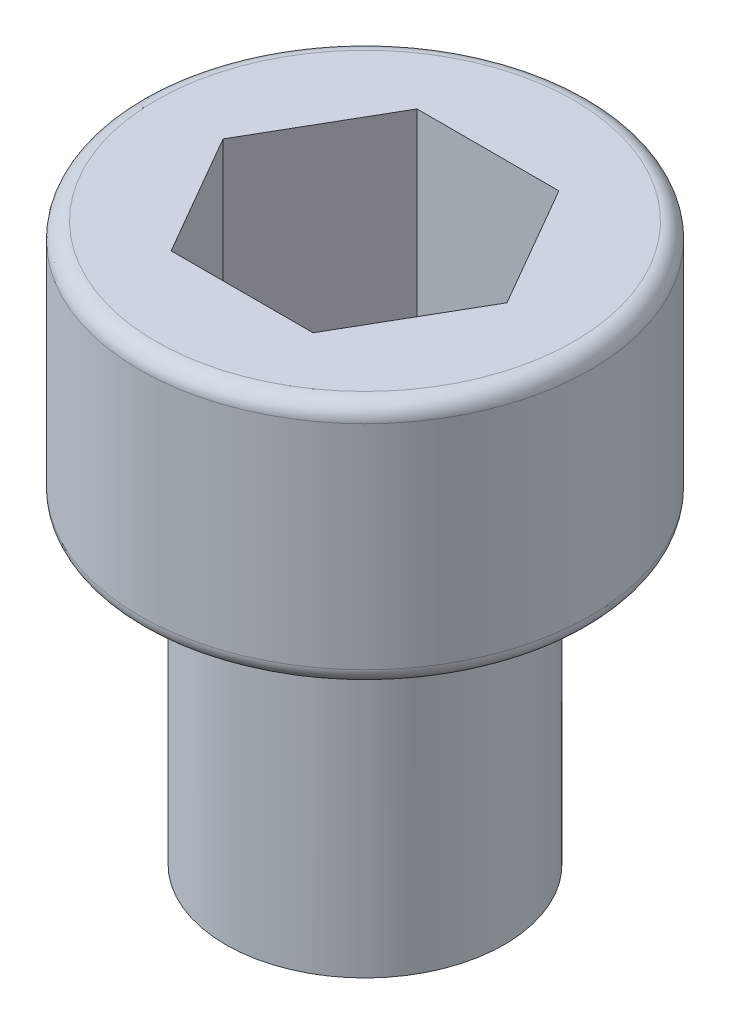
ISO-10303-21;
HEADER;
FILE_DESCRIPTION(('STEP AP214'),'2;1');
FILE_NAME('part.step','',(''),(''),'','','');
FILE_SCHEMA(('AUTOMOTIVE_DESIGN { 1 0 10303 214 1 1 1 1 }'));
ENDSEC;
DATA;
#1=APPLICATION_CONTEXT('core data for automotive mechanical design processes');
#2=APPLICATION_PROTOCOL_DEFINITION('international standard','automotive_design',2000,#1);
#3=PRODUCT_CONTEXT('',#1,'mechanical');
#4=PRODUCT('Part','Part','',(#3));
#5=PRODUCT_RELATED_PRODUCT_CATEGORY('part','',(#4));
#6=PRODUCT_DEFINITION_FORMATION('','',#4);
#7=PRODUCT_DEFINITION_CONTEXT('part definition',#1,'design');
#8=PRODUCT_DEFINITION('design','',#6,#7);
#9=PRODUCT_DEFINITION_SHAPE('','',#8);
#10=(LENGTH_UNIT() NAMED_UNIT(*) SI_UNIT(.MILLI.,.METRE.));
#11=(NAMED_UNIT(*) PLANE_ANGLE_UNIT() SI_UNIT($,.RADIAN.));
#12=(NAMED_UNIT(*) SI_UNIT($,.STERADIAN.) SOLID_ANGLE_UNIT());
#13=UNCERTAINTY_MEASURE_WITH_UNIT(LENGTH_MEASURE(1.E-05),#10,'distance_accuracy_value','');
#14=(GEOMETRIC_REPRESENTATION_CONTEXT(3) GLOBAL_UNCERTAINTY_ASSIGNED_CONTEXT((#13)) GLOBAL_UNIT_ASSIGNED_CONTEXT((#10,
#11,#12)) REPRESENTATION_CONTEXT('',''));
#15=CARTESIAN_POINT('',(0.,0.,0.));
#16=DIRECTION('',(0.,0.,1.));
#17=DIRECTION('',(1.,0.,0.));
#18=AXIS2_PLACEMENT_3D('',#15,#16,#17);
#19=CARTESIAN_POINT('',(0.,0.,0.));
#20=DIRECTION('',(0.,1.,0.));
#21=DIRECTION('',(0.,0.,1.));
#22=AXIS2_PLACEMENT_3D('',#19,#20,#21);
#23=PLANE('',#22);
#24=CARTESIAN_POINT('',(0.,0.,0.));
#25=DIRECTION('',(0.,1.,0.));
#26=DIRECTION('',(0.,0.,1.));
#27=AXIS2_PLACEMENT_3D('',#24,#25,#26);
#28=CIRCLE('',#27,2.159);
#29=CARTESIAN_POINT('',(0.,0.,2.159));
#30=VERTEX_POINT('',#29);
#31=EDGE_CURVE('E199',#30,#30,#28,.T.);
#32=ORIENTED_EDGE('',*,*,#31,.F.);
#33=EDGE_LOOP('',(#32));
#34=FACE_BOUND('',#33,.T.);
#35=ADVANCED_FACE('F32',(#34),#23,.F.);
#36=CARTESIAN_POINT('',(0.,0.,0.));
#37=DIRECTION('',(0.,1.,0.));
#38=DIRECTION('',(0.,0.,1.));
#39=AXIS2_PLACEMENT_3D('',#36,#37,#38);
#40=CYLINDRICAL_SURFACE('',#39,2.159);
#41=CARTESIAN_POINT('',(0.,4.826,0.));
#42=DIRECTION('',(0.,1.,0.));
#43=DIRECTION('',(0.,0.,1.));
#44=AXIS2_PLACEMENT_3D('',#41,#42,#43);
#45=CIRCLE('',#44,2.159);
#46=CARTESIAN_POINT('',(1.016,4.826,1.905));
#47=VERTEX_POINT('',#46);
#48=CARTESIAN_POINT('',(1.14177839420936,4.826,1.83238181024499));
#49=VERTEX_POINT('',#48);
#50=EDGE_CURVE('E197',#47,#49,#45,.T.);
#51=ORIENTED_EDGE('',*,*,#50,.F.);
#52=CARTESIAN_POINT('',(-1.01599999999999,4.826,1.905));
#53=VERTEX_POINT('',#52);
#54=EDGE_CURVE('E189',#53,#47,#45,.T.);
#55=ORIENTED_EDGE('',*,*,#54,.F.);
#56=CARTESIAN_POINT('',(-1.14177839420935,4.826,1.83238181024499));
#57=VERTEX_POINT('',#56);
#58=EDGE_CURVE('E370',#57,#53,#45,.T.);
#59=ORIENTED_EDGE('',*,*,#58,.F.);
#60=CARTESIAN_POINT('',(-2.15777839420935,4.826,0.072618189755009));
#61=VERTEX_POINT('',#60);
#62=EDGE_CURVE('E361',#61,#57,#45,.T.);
#63=ORIENTED_EDGE('',*,*,#62,.F.);
#64=CARTESIAN_POINT('',(-2.15777839420935,4.826,-0.072618189755012));
#65=VERTEX_POINT('',#64);
#66=EDGE_CURVE('E368',#65,#61,#45,.T.);
#67=ORIENTED_EDGE('',*,*,#66,.F.);
#68=CARTESIAN_POINT('',(-1.14177839420935,4.826,-1.83238181024499));
#69=VERTEX_POINT('',#68);
#70=EDGE_CURVE('E371',#69,#65,#45,.T.);
#71=ORIENTED_EDGE('',*,*,#70,.F.);
#72=CARTESIAN_POINT('',(-1.016,4.826,-1.905));
#73=VERTEX_POINT('',#72);
#74=EDGE_CURVE('E384',#73,#69,#45,.T.);
#75=ORIENTED_EDGE('',*,*,#74,.F.);
#76=CARTESIAN_POINT('',(1.01600000000001,4.826,-1.905));
#77=VERTEX_POINT('',#76);
#78=EDGE_CURVE('E382',#77,#73,#45,.T.);
#79=ORIENTED_EDGE('',*,*,#78,.F.);
#80=CARTESIAN_POINT('',(1.14177839420936,4.826,-1.83238181024499));
#81=VERTEX_POINT('',#80);
#82=EDGE_CURVE('E381',#81,#77,#45,.T.);
#83=ORIENTED_EDGE('',*,*,#82,.F.);
#84=CARTESIAN_POINT('',(2.15777839420936,4.826,-0.0726181897550125));
#85=VERTEX_POINT('',#84);
#86=EDGE_CURVE('E150',#85,#81,#45,.T.);
#87=ORIENTED_EDGE('',*,*,#86,.F.);
#88=CARTESIAN_POINT('',(2.15777839420936,4.826,0.0726181897550073));
#89=VERTEX_POINT('',#88);
#90=EDGE_CURVE('E380',#89,#85,#45,.T.);
#91=ORIENTED_EDGE('',*,*,#90,.F.);
#92=EDGE_CURVE('E200',#49,#89,#45,.T.);
#93=ORIENTED_EDGE('',*,*,#92,.F.);
#94=EDGE_LOOP('',(#51,#55,#59,#63,#67,#71,#75,#79,#83,#87,#91,#93));
#95=FACE_BOUND('',#94,.T.);
#96=ORIENTED_EDGE('',*,*,#31,.T.);
#97=EDGE_LOOP('',(#96));
#98=FACE_BOUND('',#97,.T.);
#99=ADVANCED_FACE('F229',(#95,#98),#40,.T.);
#100=CARTESIAN_POINT('',(2.159,4.826,0.));
#101=DIRECTION('',(0.,1.,0.));
#102=DIRECTION('',(0.,0.,1.));
#103=AXIS2_PLACEMENT_3D('',#100,#101,#102);
#104=PLANE('',#103);
#105=CARTESIAN_POINT('',(0.,4.826,0.));
#106=DIRECTION('',(0.,1.,0.));
#107=DIRECTION('',(0.,0.,1.));
#108=AXIS2_PLACEMENT_3D('',#105,#106,#107);
#109=CIRCLE('',#108,3.2385);
#110=CARTESIAN_POINT('',(0.,4.826,3.2385));
#111=VERTEX_POINT('',#110);
#112=EDGE_CURVE('E11',#111,#111,#109,.F.);
#113=ORIENTED_EDGE('',*,*,#112,.T.);
#114=EDGE_LOOP('',(#113));
#115=FACE_BOUND('',#114,.T.);
#116=DIRECTION('',(0.5,0.,-0.866025403784439));
#117=VECTOR('',#116,1.);
#118=CARTESIAN_POINT('',(1.09985226280624,4.826,1.905));
#119=LINE('',#118,#117);
#120=CARTESIAN_POINT('',(2.19970452561249,4.826,0.));
#121=VERTEX_POINT('',#120);
#122=EDGE_CURVE('E172',#89,#121,#119,.T.);
#123=ORIENTED_EDGE('',*,*,#122,.T.);
#124=DIRECTION('',(-0.5,0.,-0.866025403784439));
#125=VECTOR('',#124,1.);
#126=CARTESIAN_POINT('',(2.19970452561249,4.826,0.));
#127=LINE('',#126,#125);
#128=EDGE_CURVE('E47',#121,#85,#127,.T.);
#129=ORIENTED_EDGE('',*,*,#128,.T.);
#130=ORIENTED_EDGE('',*,*,#86,.T.);
#131=CARTESIAN_POINT('',(1.09985226280624,4.826,-1.905));
#132=VERTEX_POINT('',#131);
#133=EDGE_CURVE('E125',#81,#132,#127,.T.);
#134=ORIENTED_EDGE('',*,*,#133,.T.);
#135=DIRECTION('',(-1.,0.,0.));
#136=VECTOR('',#135,1.);
#137=CARTESIAN_POINT('',(1.09985226280624,4.826,-1.905));
#138=LINE('',#137,#136);
#139=EDGE_CURVE('E135',#132,#77,#138,.T.);
#140=ORIENTED_EDGE('',*,*,#139,.T.);
#141=ORIENTED_EDGE('',*,*,#78,.T.);
#142=CARTESIAN_POINT('',(-1.09985226280624,4.826,-1.905));
#143=VERTEX_POINT('',#142);
#144=EDGE_CURVE('E145',#73,#143,#138,.T.);
#145=ORIENTED_EDGE('',*,*,#144,.T.);
#146=DIRECTION('',(-0.5,0.,0.866025403784439));
#147=VECTOR('',#146,1.);
#148=CARTESIAN_POINT('',(-1.09985226280624,4.826,-1.905));
#149=LINE('',#148,#147);
#150=EDGE_CURVE('E160',#143,#69,#149,.T.);
#151=ORIENTED_EDGE('',*,*,#150,.T.);
#152=ORIENTED_EDGE('',*,*,#70,.T.);
#153=CARTESIAN_POINT('',(-2.19970452561247,4.826,0.));
#154=VERTEX_POINT('',#153);
#155=EDGE_CURVE('E143',#65,#154,#149,.T.);
#156=ORIENTED_EDGE('',*,*,#155,.T.);
#157=DIRECTION('',(0.5,0.,0.866025403784439));
#158=VECTOR('',#157,1.);
#159=CARTESIAN_POINT('',(-2.19970452561247,4.826,0.));
#160=LINE('',#159,#158);
#161=EDGE_CURVE('E164',#154,#61,#160,.T.);
#162=ORIENTED_EDGE('',*,*,#161,.T.);
#163=ORIENTED_EDGE('',*,*,#62,.T.);
#164=CARTESIAN_POINT('',(-1.09985226280624,4.826,1.905));
#165=VERTEX_POINT('',#164);
#166=EDGE_CURVE('E162',#57,#165,#160,.T.);
#167=ORIENTED_EDGE('',*,*,#166,.T.);
#168=DIRECTION('',(1.,0.,0.));
#169=VECTOR('',#168,1.);
#170=CARTESIAN_POINT('',(-1.09985226280624,4.826,1.905));
#171=LINE('',#170,#169);
#172=EDGE_CURVE('E169',#165,#53,#171,.T.);
#173=ORIENTED_EDGE('',*,*,#172,.T.);
#174=ORIENTED_EDGE('',*,*,#54,.T.);
#175=CARTESIAN_POINT('',(1.09985226280624,4.826,1.905));
#176=VERTEX_POINT('',#175);
#177=EDGE_CURVE('E167',#47,#176,#171,.T.);
#178=ORIENTED_EDGE('',*,*,#177,.T.);
#179=EDGE_CURVE('E55',#176,#49,#119,.T.);
#180=ORIENTED_EDGE('',*,*,#179,.T.);
#181=ORIENTED_EDGE('',*,*,#92,.T.);
#182=EDGE_LOOP('',(#123,#129,#130,#134,#140,#141,#145,#151,#152,#156,#162,#163,#167,#173,#174,
#178,#180,#181));
#183=FACE_BOUND('',#182,.T.);
#184=ADVANCED_FACE('F148',(#115,#183),#104,.F.);
#185=CARTESIAN_POINT('',(0.,0.,0.));
#186=DIRECTION('',(0.,1.,0.));
#187=DIRECTION('',(0.,0.,1.));
#188=AXIS2_PLACEMENT_3D('',#185,#186,#187);
#189=CYLINDRICAL_SURFACE('',#188,3.4925);
#190=CARTESIAN_POINT('',(0.,8.382,0.));
#191=DIRECTION('',(0.,-1.,0.));
#192=DIRECTION('',(0.,0.,-1.));
#193=AXIS2_PLACEMENT_3D('',#190,#191,#192);
#194=CIRCLE('',#193,3.4925);
#195=CARTESIAN_POINT('',(0.,8.382,-3.4925));
#196=VERTEX_POINT('',#195);
#197=EDGE_CURVE('E40',#196,#196,#194,.T.);
#198=ORIENTED_EDGE('',*,*,#197,.T.);
#199=EDGE_LOOP('',(#198));
#200=FACE_BOUND('',#199,.T.);
#201=CARTESIAN_POINT('',(0.,5.08,0.));
#202=DIRECTION('',(0.,1.,0.));
#203=DIRECTION('',(0.,0.,1.));
#204=AXIS2_PLACEMENT_3D('',#201,#202,#203);
#205=CIRCLE('',#204,3.4925);
#206=CARTESIAN_POINT('',(0.,5.08,3.4925));
#207=VERTEX_POINT('',#206);
#208=EDGE_CURVE('E206',#207,#207,#205,.T.);
#209=ORIENTED_EDGE('',*,*,#208,.T.);
#210=EDGE_LOOP('',(#209));
#211=FACE_BOUND('',#210,.T.);
#212=ADVANCED_FACE('F211',(#200,#211),#189,.T.);
#213=CARTESIAN_POINT('',(3.49250000000001,8.636,0.));
#214=DIRECTION('',(0.,-1.,0.));
#215=DIRECTION('',(0.,0.,-1.));
#216=AXIS2_PLACEMENT_3D('',#213,#214,#215);
#217=PLANE('',#216);
#218=DIRECTION('',(-1.,0.,0.));
#219=VECTOR('',#218,1.);
#220=CARTESIAN_POINT('',(1.09985226280624,8.636,-1.905));
#221=LINE('',#220,#219);
#222=CARTESIAN_POINT('',(1.09985226280624,8.636,-1.905));
#223=VERTEX_POINT('',#222);
#224=CARTESIAN_POINT('',(-1.09985226280624,8.636,-1.905));
#225=VERTEX_POINT('',#224);
#226=EDGE_CURVE('E177',#223,#225,#221,.T.);
#227=ORIENTED_EDGE('',*,*,#226,.F.);
#228=DIRECTION('',(-0.5,0.,-0.866025403784439));
#229=VECTOR('',#228,1.);
#230=CARTESIAN_POINT('',(2.19970452561249,8.636,0.));
#231=LINE('',#230,#229);
#232=CARTESIAN_POINT('',(2.19970452561249,8.636,0.));
#233=VERTEX_POINT('',#232);
#234=EDGE_CURVE('E128',#233,#223,#231,.T.);
#235=ORIENTED_EDGE('',*,*,#234,.F.);
#236=DIRECTION('',(0.5,0.,-0.866025403784439));
#237=VECTOR('',#236,1.);
#238=CARTESIAN_POINT('',(1.09985226280624,8.636,1.905));
#239=LINE('',#238,#237);
#240=CARTESIAN_POINT('',(1.09985226280624,8.636,1.905));
#241=VERTEX_POINT('',#240);
#242=EDGE_CURVE('E152',#241,#233,#239,.T.);
#243=ORIENTED_EDGE('',*,*,#242,.F.);
#244=DIRECTION('',(1.,0.,0.));
#245=VECTOR('',#244,1.);
#246=CARTESIAN_POINT('',(-1.09985226280624,8.636,1.905));
#247=LINE('',#246,#245);
#248=CARTESIAN_POINT('',(-1.09985226280624,8.636,1.905));
#249=VERTEX_POINT('',#248);
#250=EDGE_CURVE('E155',#249,#241,#247,.T.);
#251=ORIENTED_EDGE('',*,*,#250,.F.);
#252=DIRECTION('',(0.5,0.,0.866025403784439));
#253=VECTOR('',#252,1.);
#254=CARTESIAN_POINT('',(-2.19970452561247,8.636,0.));
#255=LINE('',#254,#253);
#256=CARTESIAN_POINT('',(-2.19970452561247,8.636,0.));
#257=VERTEX_POINT('',#256);
#258=EDGE_CURVE('E182',#257,#249,#255,.T.);
#259=ORIENTED_EDGE('',*,*,#258,.F.);
#260=DIRECTION('',(-0.5,0.,0.866025403784439));
#261=VECTOR('',#260,1.);
#262=CARTESIAN_POINT('',(-1.09985226280624,8.636,-1.905));
#263=LINE('',#262,#261);
#264=EDGE_CURVE('E179',#225,#257,#263,.T.);
#265=ORIENTED_EDGE('',*,*,#264,.F.);
#266=EDGE_LOOP('',(#227,#235,#243,#251,#259,#265));
#267=FACE_BOUND('',#266,.T.);
#268=CARTESIAN_POINT('',(0.,8.636,0.));
#269=DIRECTION('',(0.,-1.,0.));
#270=DIRECTION('',(0.,0.,-1.));
#271=AXIS2_PLACEMENT_3D('',#268,#269,#270);
#272=CIRCLE('',#271,3.2385);
#273=CARTESIAN_POINT('',(0.,8.636,-3.2385));
#274=VERTEX_POINT('',#273);
#275=EDGE_CURVE('E203',#274,#274,#272,.F.);
#276=ORIENTED_EDGE('',*,*,#275,.T.);
#277=EDGE_LOOP('',(#276));
#278=FACE_BOUND('',#277,.T.);
#279=ADVANCED_FACE('F217',(#267,#278),#217,.F.);
#280=CARTESIAN_POINT('',(0.,8.382,0.));
#281=DIRECTION('',(0.,-1.,0.));
#282=DIRECTION('',(0.,0.,-1.));
#283=AXIS2_PLACEMENT_3D('',#280,#281,#282);
#284=TOROIDAL_SURFACE('',#283,3.2385,0.254);
#285=ORIENTED_EDGE('',*,*,#197,.F.);
#286=EDGE_LOOP('',(#285));
#287=FACE_BOUND('',#286,.T.);
#288=ORIENTED_EDGE('',*,*,#275,.F.);
#289=EDGE_LOOP('',(#288));
#290=FACE_BOUND('',#289,.T.);
#291=ADVANCED_FACE('F214',(#287,#290),#284,.T.);
#292=CARTESIAN_POINT('',(0.,5.08,0.));
#293=DIRECTION('',(0.,1.,0.));
#294=DIRECTION('',(0.,0.,1.));
#295=AXIS2_PLACEMENT_3D('',#292,#293,#294);
#296=TOROIDAL_SURFACE('',#295,3.2385,0.254);
#297=ORIENTED_EDGE('',*,*,#112,.F.);
#298=EDGE_LOOP('',(#297));
#299=FACE_BOUND('',#298,.T.);
#300=ORIENTED_EDGE('',*,*,#208,.F.);
#301=EDGE_LOOP('',(#300));
#302=FACE_BOUND('',#301,.T.);
#303=ADVANCED_FACE('F34',(#299,#302),#296,.T.);
#304=CARTESIAN_POINT('',(0.,4.826,0.));
#305=DIRECTION('',(0.,1.,0.));
#306=DIRECTION('',(0.,0.,1.));
#307=AXIS2_PLACEMENT_3D('',#304,#305,#306);
#308=PLANE('',#307);
#309=ORIENTED_EDGE('',*,*,#50,.T.);
#310=EDGE_CURVE('E175',#49,#89,#119,.T.);
#311=ORIENTED_EDGE('',*,*,#310,.T.);
#312=ORIENTED_EDGE('',*,*,#90,.T.);
#313=EDGE_CURVE('E151',#85,#81,#127,.T.);
#314=ORIENTED_EDGE('',*,*,#313,.T.);
#315=ORIENTED_EDGE('',*,*,#82,.T.);
#316=EDGE_CURVE('E138',#77,#73,#138,.T.);
#317=ORIENTED_EDGE('',*,*,#316,.T.);
#318=ORIENTED_EDGE('',*,*,#74,.T.);
#319=EDGE_CURVE('E163',#69,#65,#149,.T.);
#320=ORIENTED_EDGE('',*,*,#319,.T.);
#321=ORIENTED_EDGE('',*,*,#66,.T.);
#322=EDGE_CURVE('E168',#61,#57,#160,.T.);
#323=ORIENTED_EDGE('',*,*,#322,.T.);
#324=ORIENTED_EDGE('',*,*,#58,.T.);
#325=EDGE_CURVE('E173',#53,#47,#171,.T.);
#326=ORIENTED_EDGE('',*,*,#325,.T.);
#327=EDGE_LOOP('',(#309,#311,#312,#314,#315,#317,#318,#320,#321,#323,#324,#326));
#328=FACE_BOUND('',#327,.T.);
#329=ADVANCED_FACE('F247',(#328),#308,.T.);
#330=CARTESIAN_POINT('',(2.19970452561249,4.826,0.));
#331=DIRECTION('',(0.866025403784439,0.,-0.5));
#332=DIRECTION('',(-0.5,0.,-0.866025403784439));
#333=AXIS2_PLACEMENT_3D('',#330,#331,#332);
#334=PLANE('',#333);
#335=ORIENTED_EDGE('',*,*,#234,.T.);
#336=DIRECTION('',(0.,1.,0.));
#337=VECTOR('',#336,1.);
#338=CARTESIAN_POINT('',(1.09985226280624,4.826,-1.905));
#339=LINE('',#338,#337);
#340=EDGE_CURVE('E121',#132,#223,#339,.T.);
#341=ORIENTED_EDGE('',*,*,#340,.F.);
#342=ORIENTED_EDGE('',*,*,#133,.F.);
#343=ORIENTED_EDGE('',*,*,#313,.F.);
#344=ORIENTED_EDGE('',*,*,#128,.F.);
#345=DIRECTION('',(0.,1.,0.));
#346=VECTOR('',#345,1.);
#347=CARTESIAN_POINT('',(2.19970452561249,4.826,0.));
#348=LINE('',#347,#346);
#349=EDGE_CURVE('E187',#121,#233,#348,.T.);
#350=ORIENTED_EDGE('',*,*,#349,.T.);
#351=EDGE_LOOP('',(#335,#341,#342,#343,#344,#350));
#352=FACE_BOUND('',#351,.T.);
#353=ADVANCED_FACE('F123',(#352),#334,.F.);
#354=CARTESIAN_POINT('',(1.09985226280624,4.826,1.905));
#355=DIRECTION('',(0.866025403784439,0.,0.5));
#356=DIRECTION('',(0.5,0.,-0.866025403784439));
#357=AXIS2_PLACEMENT_3D('',#354,#355,#356);
#358=PLANE('',#357);
#359=ORIENTED_EDGE('',*,*,#242,.T.);
#360=ORIENTED_EDGE('',*,*,#349,.F.);
#361=ORIENTED_EDGE('',*,*,#122,.F.);
#362=ORIENTED_EDGE('',*,*,#310,.F.);
#363=ORIENTED_EDGE('',*,*,#179,.F.);
#364=DIRECTION('',(0.,1.,0.));
#365=VECTOR('',#364,1.);
#366=CARTESIAN_POINT('',(1.09985226280624,4.826,1.905));
#367=LINE('',#366,#365);
#368=EDGE_CURVE('E190',#176,#241,#367,.T.);
#369=ORIENTED_EDGE('',*,*,#368,.T.);
#370=EDGE_LOOP('',(#359,#360,#361,#362,#363,#369));
#371=FACE_BOUND('',#370,.T.);
#372=ADVANCED_FACE('F257',(#371),#358,.F.);
#373=CARTESIAN_POINT('',(-1.09985226280624,4.826,1.905));
#374=DIRECTION('',(0.,0.,1.));
#375=DIRECTION('',(1.,0.,0.));
#376=AXIS2_PLACEMENT_3D('',#373,#374,#375);
#377=PLANE('',#376);
#378=ORIENTED_EDGE('',*,*,#250,.T.);
#379=ORIENTED_EDGE('',*,*,#368,.F.);
#380=ORIENTED_EDGE('',*,*,#177,.F.);
#381=ORIENTED_EDGE('',*,*,#325,.F.);
#382=ORIENTED_EDGE('',*,*,#172,.F.);
#383=DIRECTION('',(0.,1.,0.));
#384=VECTOR('',#383,1.);
#385=CARTESIAN_POINT('',(-1.09985226280624,4.826,1.905));
#386=LINE('',#385,#384);
#387=EDGE_CURVE('E192',#165,#249,#386,.T.);
#388=ORIENTED_EDGE('',*,*,#387,.T.);
#389=EDGE_LOOP('',(#378,#379,#380,#381,#382,#388));
#390=FACE_BOUND('',#389,.T.);
#391=ADVANCED_FACE('F261',(#390),#377,.F.);
#392=CARTESIAN_POINT('',(-2.19970452561247,4.826,0.));
#393=DIRECTION('',(-0.866025403784439,0.,0.5));
#394=DIRECTION('',(0.5,0.,0.866025403784439));
#395=AXIS2_PLACEMENT_3D('',#392,#393,#394);
#396=PLANE('',#395);
#397=ORIENTED_EDGE('',*,*,#258,.T.);
#398=ORIENTED_EDGE('',*,*,#387,.F.);
#399=ORIENTED_EDGE('',*,*,#166,.F.);
#400=ORIENTED_EDGE('',*,*,#322,.F.);
#401=ORIENTED_EDGE('',*,*,#161,.F.);
#402=DIRECTION('',(0.,1.,0.));
#403=VECTOR('',#402,1.);
#404=CARTESIAN_POINT('',(-2.19970452561247,4.826,0.));
#405=LINE('',#404,#403);
#406=EDGE_CURVE('E194',#154,#257,#405,.T.);
#407=ORIENTED_EDGE('',*,*,#406,.T.);
#408=EDGE_LOOP('',(#397,#398,#399,#400,#401,#407));
#409=FACE_BOUND('',#408,.T.);
#410=ADVANCED_FACE('F264',(#409),#396,.F.);
#411=CARTESIAN_POINT('',(-1.09985226280624,4.826,-1.905));
#412=DIRECTION('',(-0.866025403784439,0.,-0.5));
#413=DIRECTION('',(-0.5,0.,0.866025403784439));
#414=AXIS2_PLACEMENT_3D('',#411,#412,#413);
#415=PLANE('',#414);
#416=ORIENTED_EDGE('',*,*,#264,.T.);
#417=ORIENTED_EDGE('',*,*,#406,.F.);
#418=ORIENTED_EDGE('',*,*,#155,.F.);
#419=ORIENTED_EDGE('',*,*,#319,.F.);
#420=ORIENTED_EDGE('',*,*,#150,.F.);
#421=DIRECTION('',(0.,1.,0.));
#422=VECTOR('',#421,1.);
#423=CARTESIAN_POINT('',(-1.09985226280624,4.826,-1.905));
#424=LINE('',#423,#422);
#425=EDGE_CURVE('E132',#143,#225,#424,.T.);
#426=ORIENTED_EDGE('',*,*,#425,.T.);
#427=EDGE_LOOP('',(#416,#417,#418,#419,#420,#426));
#428=FACE_BOUND('',#427,.T.);
#429=ADVANCED_FACE('F268',(#428),#415,.F.);
#430=CARTESIAN_POINT('',(1.09985226280624,4.826,-1.905));
#431=DIRECTION('',(0.,0.,-1.));
#432=DIRECTION('',(-1.,0.,0.));
#433=AXIS2_PLACEMENT_3D('',#430,#431,#432);
#434=PLANE('',#433);
#435=ORIENTED_EDGE('',*,*,#226,.T.);
#436=ORIENTED_EDGE('',*,*,#425,.F.);
#437=ORIENTED_EDGE('',*,*,#144,.F.);
#438=ORIENTED_EDGE('',*,*,#316,.F.);
#439=ORIENTED_EDGE('',*,*,#139,.F.);
#440=ORIENTED_EDGE('',*,*,#340,.T.);
#441=EDGE_LOOP('',(#435,#436,#437,#438,#439,#440));
#442=FACE_BOUND('',#441,.T.);
#443=ADVANCED_FACE('F136',(#442),#434,.F.);
#444=CLOSED_SHELL('',(#35,#99,#184,#212,#279,#291,#303,#329,#353,#372,#391,#410,#429,#443));
#445=MANIFOLD_SOLID_BREP('B2',#444);
#446=ADVANCED_BREP_SHAPE_REPRESENTATION('',(#18,#445),#14);
#447=SHAPE_DEFINITION_REPRESENTATION(#9,#446);
ENDSEC;
END-ISO-10303-21;
